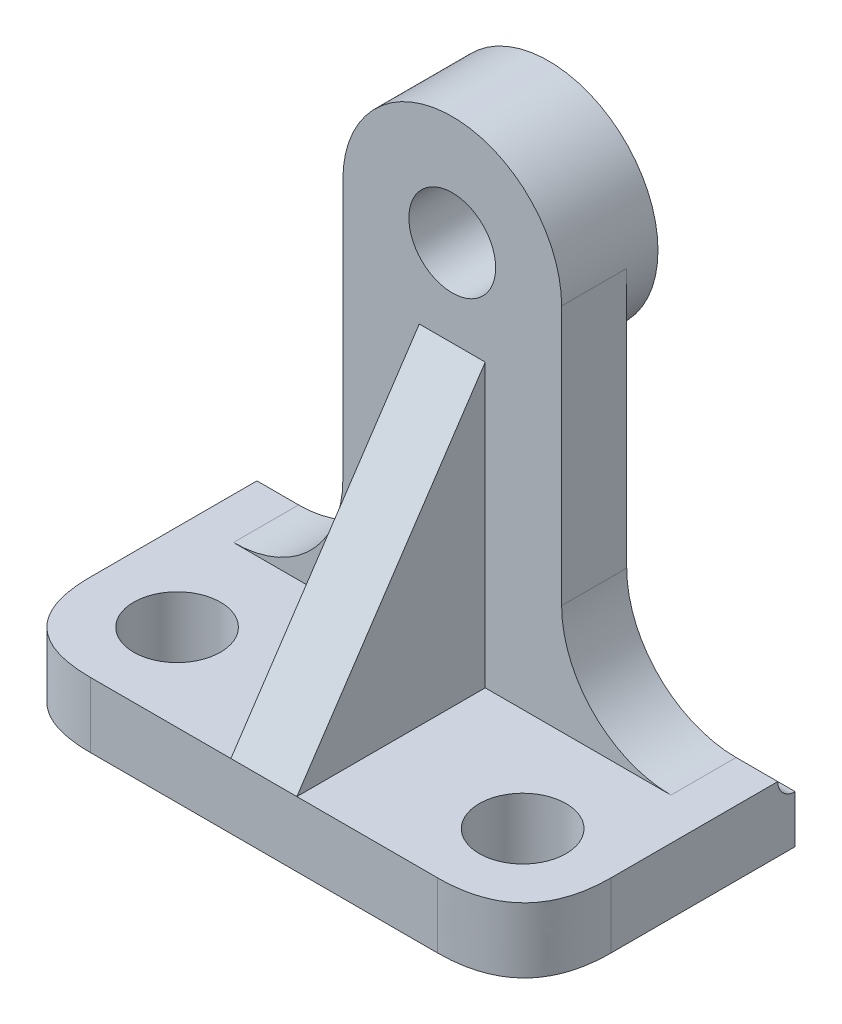
ISO-10303-21;
HEADER;
FILE_DESCRIPTION(('STEP AP214'),'2;1');
FILE_NAME('part.step','',(''),(''),'','','');
FILE_SCHEMA(('AUTOMOTIVE_DESIGN { 1 0 10303 214 1 1 1 1 }'));
ENDSEC;
DATA;
#1=APPLICATION_CONTEXT('core data for automotive mechanical design processes');
#2=APPLICATION_PROTOCOL_DEFINITION('international standard','automotive_design',2000,#1);
#3=PRODUCT_CONTEXT('',#1,'mechanical');
#4=PRODUCT('Part','Part','',(#3));
#5=PRODUCT_RELATED_PRODUCT_CATEGORY('part','',(#4));
#6=PRODUCT_DEFINITION_FORMATION('','',#4);
#7=PRODUCT_DEFINITION_CONTEXT('part definition',#1,'design');
#8=PRODUCT_DEFINITION('design','',#6,#7);
#9=PRODUCT_DEFINITION_SHAPE('','',#8);
#10=(LENGTH_UNIT() NAMED_UNIT(*) SI_UNIT(.MILLI.,.METRE.));
#11=(NAMED_UNIT(*) PLANE_ANGLE_UNIT() SI_UNIT($,.RADIAN.));
#12=(NAMED_UNIT(*) SI_UNIT($,.STERADIAN.) SOLID_ANGLE_UNIT());
#13=UNCERTAINTY_MEASURE_WITH_UNIT(LENGTH_MEASURE(1.E-05),#10,'distance_accuracy_value','');
#14=(GEOMETRIC_REPRESENTATION_CONTEXT(3) GLOBAL_UNCERTAINTY_ASSIGNED_CONTEXT((#13)) GLOBAL_UNIT_ASSIGNED_CONTEXT((#10,
#11,#12)) REPRESENTATION_CONTEXT('',''));
#15=CARTESIAN_POINT('',(0.,0.,0.));
#16=DIRECTION('',(0.,0.,1.));
#17=DIRECTION('',(1.,0.,0.));
#18=AXIS2_PLACEMENT_3D('',#15,#16,#17);
#19=CARTESIAN_POINT('',(0.,0.,0.));
#20=DIRECTION('',(0.,-1.,0.));
#21=DIRECTION('',(0.,0.,-1.));
#22=AXIS2_PLACEMENT_3D('',#19,#20,#21);
#23=PLANE('',#22);
#24=DIRECTION('',(0.,0.,-1.));
#25=VECTOR('',#24,1.);
#26=CARTESIAN_POINT('',(-4.826,0.,19.812));
#27=LINE('',#26,#25);
#28=CARTESIAN_POINT('',(-4.826,0.,19.812));
#29=VERTEX_POINT('',#28);
#30=CARTESIAN_POINT('',(-4.826,0.,-7.747));
#31=VERTEX_POINT('',#30);
#32=EDGE_CURVE('E627',#29,#31,#27,.T.);
#33=ORIENTED_EDGE('',*,*,#32,.T.);
#34=DIRECTION('',(1.,0.,0.));
#35=VECTOR('',#34,1.);
#36=CARTESIAN_POINT('',(-32.004,0.,-7.747));
#37=LINE('',#36,#35);
#38=CARTESIAN_POINT('',(-32.004,0.,-7.747));
#39=VERTEX_POINT('',#38);
#40=EDGE_CURVE('E195',#39,#31,#37,.T.);
#41=ORIENTED_EDGE('',*,*,#40,.F.);
#42=DIRECTION('',(0.,0.,-1.));
#43=VECTOR('',#42,1.);
#44=CARTESIAN_POINT('',(-32.004,0.,-7.747));
#45=LINE('',#44,#43);
#46=CARTESIAN_POINT('',(-32.004,0.,-17.272));
#47=VERTEX_POINT('',#46);
#48=EDGE_CURVE('E239',#39,#47,#45,.T.);
#49=ORIENTED_EDGE('',*,*,#48,.T.);
#50=DIRECTION('',(1.,0.,0.));
#51=VECTOR('',#50,1.);
#52=CARTESIAN_POINT('',(-38.1,0.,-17.272));
#53=LINE('',#52,#51);
#54=CARTESIAN_POINT('',(-38.1,0.,-17.272));
#55=VERTEX_POINT('',#54);
#56=EDGE_CURVE('E264',#55,#47,#53,.T.);
#57=ORIENTED_EDGE('',*,*,#56,.F.);
#58=DIRECTION('',(0.,0.,1.));
#59=VECTOR('',#58,1.);
#60=CARTESIAN_POINT('',(-38.1,0.,19.812));
#61=LINE('',#60,#59);
#62=CARTESIAN_POINT('',(-38.1,0.,7.112));
#63=VERTEX_POINT('',#62);
#64=EDGE_CURVE('E427',#55,#63,#61,.T.);
#65=ORIENTED_EDGE('',*,*,#64,.T.);
#66=CARTESIAN_POINT('',(-25.4,0.,19.812));
#67=CARTESIAN_POINT('',(-38.1,0.,19.812));
#68=CARTESIAN_POINT('',(-38.1,0.,7.112));
#69=(BOUNDED_CURVE() B_SPLINE_CURVE(2,(#66,#67,#68),.UNSPECIFIED.,.F.,
.F.) B_SPLINE_CURVE_WITH_KNOTS((3,3),(0.,1.),
.UNSPECIFIED.) CURVE() GEOMETRIC_REPRESENTATION_ITEM() RATIONAL_B_SPLINE_CURVE((1.,1.,1.)) REPRESENTATION_ITEM(''));
#70=CARTESIAN_POINT('',(-25.4,0.,19.812));
#71=VERTEX_POINT('',#70);
#72=EDGE_CURVE('E455',#63,#71,#69,.F.);
#73=ORIENTED_EDGE('',*,*,#72,.T.);
#74=DIRECTION('',(1.,0.,0.));
#75=VECTOR('',#74,1.);
#76=CARTESIAN_POINT('',(-38.1,0.,19.812));
#77=LINE('',#76,#75);
#78=EDGE_CURVE('E277',#71,#29,#77,.T.);
#79=ORIENTED_EDGE('',*,*,#78,.T.);
#80=EDGE_LOOP('',(#33,#41,#49,#57,#65,#73,#79));
#81=FACE_BOUND('',#80,.T.);
#82=CARTESIAN_POINT('',(-25.4,0.,7.112));
#83=DIRECTION('',(0.,1.,0.));
#84=DIRECTION('',(0.,0.,1.));
#85=AXIS2_PLACEMENT_3D('',#82,#83,#84);
#86=CIRCLE('',#85,6.34999999999999);
#87=CARTESIAN_POINT('',(-25.4,0.,13.462));
#88=VERTEX_POINT('',#87);
#89=EDGE_CURVE('E630',#88,#88,#86,.T.);
#90=ORIENTED_EDGE('',*,*,#89,.F.);
#91=EDGE_LOOP('',(#90));
#92=FACE_BOUND('',#91,.T.);
#93=ADVANCED_FACE('F49',(#81,#92),#23,.F.);
#94=CARTESIAN_POINT('',(25.3994401556103,0.,7.35049502420474));
#95=DIRECTION('',(0.,1.,0.));
#96=DIRECTION('',(0.,0.,1.));
#97=AXIS2_PLACEMENT_3D('',#94,#95,#96);
#98=CIRCLE('',#97,6.34999999999998);
#99=CARTESIAN_POINT('',(25.3994401556103,0.,13.7004950242047));
#100=VERTEX_POINT('',#99);
#101=EDGE_CURVE('E618',#100,#100,#98,.T.);
#102=ORIENTED_EDGE('',*,*,#101,.F.);
#103=EDGE_LOOP('',(#102));
#104=FACE_BOUND('',#103,.T.);
#105=CARTESIAN_POINT('',(4.826,0.,-7.747));
#106=VERTEX_POINT('',#105);
#107=CARTESIAN_POINT('',(32.004,0.,-7.747));
#108=VERTEX_POINT('',#107);
#109=EDGE_CURVE('E184',#106,#108,#37,.T.);
#110=ORIENTED_EDGE('',*,*,#109,.F.);
#111=DIRECTION('',(0.,0.,-1.));
#112=VECTOR('',#111,1.);
#113=CARTESIAN_POINT('',(4.826,0.,19.812));
#114=LINE('',#113,#112);
#115=CARTESIAN_POINT('',(4.826,0.,19.812));
#116=VERTEX_POINT('',#115);
#117=EDGE_CURVE('E168',#116,#106,#114,.T.);
#118=ORIENTED_EDGE('',*,*,#117,.F.);
#119=CARTESIAN_POINT('',(25.3999999999999,0.,19.812));
#120=VERTEX_POINT('',#119);
#121=EDGE_CURVE('E419',#116,#120,#77,.T.);
#122=ORIENTED_EDGE('',*,*,#121,.T.);
#123=CARTESIAN_POINT('',(38.1,0.,7.112));
#124=CARTESIAN_POINT('',(38.1,0.,19.812));
#125=CARTESIAN_POINT('',(25.4,0.,19.812));
#126=(BOUNDED_CURVE() B_SPLINE_CURVE(2,(#123,#124,#125),.UNSPECIFIED.,.F.,
.F.) B_SPLINE_CURVE_WITH_KNOTS((3,3),(0.,1.),
.UNSPECIFIED.) CURVE() GEOMETRIC_REPRESENTATION_ITEM() RATIONAL_B_SPLINE_CURVE((1.,1.,1.)) REPRESENTATION_ITEM(''));
#127=CARTESIAN_POINT('',(38.1,0.,7.11200000000001));
#128=VERTEX_POINT('',#127);
#129=EDGE_CURVE('E387',#120,#128,#126,.F.);
#130=ORIENTED_EDGE('',*,*,#129,.T.);
#131=DIRECTION('',(0.,0.,-1.));
#132=VECTOR('',#131,1.);
#133=CARTESIAN_POINT('',(38.1,0.,19.812));
#134=LINE('',#133,#132);
#135=CARTESIAN_POINT('',(38.1,0.,-17.272));
#136=VERTEX_POINT('',#135);
#137=EDGE_CURVE('E263',#128,#136,#134,.T.);
#138=ORIENTED_EDGE('',*,*,#137,.T.);
#139=CARTESIAN_POINT('',(32.004,0.,-17.272));
#140=VERTEX_POINT('',#139);
#141=EDGE_CURVE('E256',#140,#136,#53,.T.);
#142=ORIENTED_EDGE('',*,*,#141,.F.);
#143=DIRECTION('',(0.,0.,-1.));
#144=VECTOR('',#143,1.);
#145=CARTESIAN_POINT('',(32.004,0.,-7.747));
#146=LINE('',#145,#144);
#147=EDGE_CURVE('E193',#108,#140,#146,.T.);
#148=ORIENTED_EDGE('',*,*,#147,.F.);
#149=EDGE_LOOP('',(#110,#118,#122,#130,#138,#142,#148));
#150=FACE_BOUND('',#149,.T.);
#151=ADVANCED_FACE('F191',(#104,#150),#23,.F.);
#152=CARTESIAN_POINT('',(38.1,-9.525,19.812));
#153=DIRECTION('',(1.,0.,0.));
#154=DIRECTION('',(0.,0.,-1.));
#155=AXIS2_PLACEMENT_3D('',#152,#153,#154);
#156=PLANE('',#155);
#157=ORIENTED_EDGE('',*,*,#137,.F.);
#158=CARTESIAN_POINT('',(38.1,-10.00125,7.112));
#159=CARTESIAN_POINT('',(38.1,-6.50875000000001,7.112));
#160=CARTESIAN_POINT('',(38.1,-3.01624999999999,7.112));
#161=CARTESIAN_POINT('',(38.1,0.476249999999999,7.112));
#162=(BOUNDED_CURVE() B_SPLINE_CURVE(3,(#158,#159,#160,#161),.UNSPECIFIED.,.F.,
.F.) B_SPLINE_CURVE_WITH_KNOTS((4,4),(-0.00047625,0.01000125),
.UNSPECIFIED.) CURVE() GEOMETRIC_REPRESENTATION_ITEM() RATIONAL_B_SPLINE_CURVE((1.,1.,1.,1.)) REPRESENTATION_ITEM(''));
#163=CARTESIAN_POINT('',(38.1,-9.525,7.112));
#164=VERTEX_POINT('',#163);
#165=EDGE_CURVE('E12',#128,#164,#162,.F.);
#166=ORIENTED_EDGE('',*,*,#165,.T.);
#167=DIRECTION('',(0.,0.,-1.));
#168=VECTOR('',#167,1.);
#169=CARTESIAN_POINT('',(38.1,-9.525,19.812));
#170=LINE('',#169,#168);
#171=CARTESIAN_POINT('',(38.1,-9.525,-19.812));
#172=VERTEX_POINT('',#171);
#173=EDGE_CURVE('E273',#164,#172,#170,.T.);
#174=ORIENTED_EDGE('',*,*,#173,.T.);
#175=DIRECTION('',(0.,1.,0.));
#176=VECTOR('',#175,1.);
#177=CARTESIAN_POINT('',(38.1,-9.525,-19.812));
#178=LINE('',#177,#176);
#179=CARTESIAN_POINT('',(38.1,-2.54,-19.812));
#180=VERTEX_POINT('',#179);
#181=EDGE_CURVE('E469',#172,#180,#178,.T.);
#182=ORIENTED_EDGE('',*,*,#181,.T.);
#183=CARTESIAN_POINT('',(38.1,0.,-19.812));
#184=DIRECTION('',(1.,0.,0.));
#185=DIRECTION('',(0.,0.,-1.));
#186=AXIS2_PLACEMENT_3D('',#183,#184,#185);
#187=CIRCLE('',#186,2.54);
#188=EDGE_CURVE('E251',#136,#180,#187,.T.);
#189=ORIENTED_EDGE('',*,*,#188,.F.);
#190=EDGE_LOOP('',(#157,#166,#174,#182,#189));
#191=FACE_BOUND('',#190,.T.);
#192=ADVANCED_FACE('F327',(#191),#156,.T.);
#193=CARTESIAN_POINT('',(-38.1,-9.525,19.812));
#194=DIRECTION('',(0.,0.,1.));
#195=DIRECTION('',(1.,0.,0.));
#196=AXIS2_PLACEMENT_3D('',#193,#194,#195);
#197=PLANE('',#196);
#198=ORIENTED_EDGE('',*,*,#78,.F.);
#199=CARTESIAN_POINT('',(-25.4,-10.00125,19.812));
#200=CARTESIAN_POINT('',(-25.4,-6.50875000000001,19.812));
#201=CARTESIAN_POINT('',(-25.4,-3.01624999999999,19.812));
#202=CARTESIAN_POINT('',(-25.4,0.476249999999999,19.812));
#203=(BOUNDED_CURVE() B_SPLINE_CURVE(3,(#199,#200,#201,#202),.UNSPECIFIED.,.F.,
.F.) B_SPLINE_CURVE_WITH_KNOTS((4,4),(-0.00047625,0.01000125),
.UNSPECIFIED.) CURVE() GEOMETRIC_REPRESENTATION_ITEM() RATIONAL_B_SPLINE_CURVE((1.,1.,1.,1.)) REPRESENTATION_ITEM(''));
#204=CARTESIAN_POINT('',(-25.4,-9.525,19.812));
#205=VERTEX_POINT('',#204);
#206=EDGE_CURVE('E374',#71,#205,#203,.F.);
#207=ORIENTED_EDGE('',*,*,#206,.T.);
#208=DIRECTION('',(1.,0.,0.));
#209=VECTOR('',#208,1.);
#210=CARTESIAN_POINT('',(-38.1,-9.525,19.812));
#211=LINE('',#210,#209);
#212=CARTESIAN_POINT('',(25.3999999999999,-9.525,19.812));
#213=VERTEX_POINT('',#212);
#214=EDGE_CURVE('E460',#205,#213,#211,.T.);
#215=ORIENTED_EDGE('',*,*,#214,.T.);
#216=CARTESIAN_POINT('',(25.4,0.476249999999999,19.812));
#217=CARTESIAN_POINT('',(25.4,-3.01624999999999,19.812));
#218=CARTESIAN_POINT('',(25.4,-6.50875000000001,19.812));
#219=CARTESIAN_POINT('',(25.4,-10.00125,19.812));
#220=(BOUNDED_CURVE() B_SPLINE_CURVE(3,(#216,#217,#218,#219),.UNSPECIFIED.,.F.,
.F.) B_SPLINE_CURVE_WITH_KNOTS((4,4),(-0.000476249999999999,0.01000125),
.UNSPECIFIED.) CURVE() GEOMETRIC_REPRESENTATION_ITEM() RATIONAL_B_SPLINE_CURVE((1.,1.,1.,1.)) REPRESENTATION_ITEM(''));
#221=EDGE_CURVE('E398',#213,#120,#220,.F.);
#222=ORIENTED_EDGE('',*,*,#221,.T.);
#223=ORIENTED_EDGE('',*,*,#121,.F.);
#224=DIRECTION('',(-1.,0.,0.));
#225=VECTOR('',#224,1.);
#226=CARTESIAN_POINT('',(4.826,0.,19.812));
#227=LINE('',#226,#225);
#228=EDGE_CURVE('E635',#116,#29,#227,.T.);
#229=ORIENTED_EDGE('',*,*,#228,.T.);
#230=EDGE_LOOP('',(#198,#207,#215,#222,#223,#229));
#231=FACE_BOUND('',#230,.T.);
#232=ADVANCED_FACE('F336',(#231),#197,.T.);
#233=CARTESIAN_POINT('',(-38.1,-9.525,19.812));
#234=DIRECTION('',(-1.,0.,0.));
#235=DIRECTION('',(0.,0.,1.));
#236=AXIS2_PLACEMENT_3D('',#233,#234,#235);
#237=PLANE('',#236);
#238=DIRECTION('',(0.,0.,1.));
#239=VECTOR('',#238,1.);
#240=CARTESIAN_POINT('',(-38.1,-9.525,19.812));
#241=LINE('',#240,#239);
#242=CARTESIAN_POINT('',(-38.1,-9.525,-19.812));
#243=VERTEX_POINT('',#242);
#244=CARTESIAN_POINT('',(-38.1,-9.525,7.112));
#245=VERTEX_POINT('',#244);
#246=EDGE_CURVE('E470',#243,#245,#241,.T.);
#247=ORIENTED_EDGE('',*,*,#246,.T.);
#248=CARTESIAN_POINT('',(-38.1,0.476249999999999,7.112));
#249=CARTESIAN_POINT('',(-38.1,-3.01624999999999,7.112));
#250=CARTESIAN_POINT('',(-38.1,-6.50875000000001,7.112));
#251=CARTESIAN_POINT('',(-38.1,-10.00125,7.112));
#252=(BOUNDED_CURVE() B_SPLINE_CURVE(3,(#248,#249,#250,#251),.UNSPECIFIED.,.F.,
.F.) B_SPLINE_CURVE_WITH_KNOTS((4,4),(-0.000476249999999999,0.01000125),
.UNSPECIFIED.) CURVE() GEOMETRIC_REPRESENTATION_ITEM() RATIONAL_B_SPLINE_CURVE((1.,1.,1.,1.)) REPRESENTATION_ITEM(''));
#253=EDGE_CURVE('E485',#245,#63,#252,.F.);
#254=ORIENTED_EDGE('',*,*,#253,.T.);
#255=ORIENTED_EDGE('',*,*,#64,.F.);
#256=CARTESIAN_POINT('',(-38.1,0.,-19.812));
#257=DIRECTION('',(1.,0.,0.));
#258=DIRECTION('',(0.,0.,-1.));
#259=AXIS2_PLACEMENT_3D('',#256,#257,#258);
#260=CIRCLE('',#259,2.54);
#261=CARTESIAN_POINT('',(-38.1,-2.54,-19.812));
#262=VERTEX_POINT('',#261);
#263=EDGE_CURVE('E252',#55,#262,#260,.T.);
#264=ORIENTED_EDGE('',*,*,#263,.T.);
#265=DIRECTION('',(0.,1.,0.));
#266=VECTOR('',#265,1.);
#267=CARTESIAN_POINT('',(-38.1,-9.525,-19.812));
#268=LINE('',#267,#266);
#269=EDGE_CURVE('E433',#243,#262,#268,.T.);
#270=ORIENTED_EDGE('',*,*,#269,.F.);
#271=EDGE_LOOP('',(#247,#254,#255,#264,#270));
#272=FACE_BOUND('',#271,.T.);
#273=ADVANCED_FACE('F488',(#272),#237,.T.);
#274=CARTESIAN_POINT('',(-38.1,-9.525,-19.812));
#275=DIRECTION('',(0.,0.,-1.));
#276=DIRECTION('',(-1.,0.,0.));
#277=AXIS2_PLACEMENT_3D('',#274,#275,#276);
#278=PLANE('',#277);
#279=DIRECTION('',(1.,0.,0.));
#280=VECTOR('',#279,1.);
#281=CARTESIAN_POINT('',(-38.1,-2.54,-19.812));
#282=LINE('',#281,#280);
#283=EDGE_CURVE('E259',#262,#180,#282,.T.);
#284=ORIENTED_EDGE('',*,*,#283,.T.);
#285=ORIENTED_EDGE('',*,*,#181,.F.);
#286=DIRECTION('',(-1.,0.,0.));
#287=VECTOR('',#286,1.);
#288=CARTESIAN_POINT('',(-38.1,-9.525,-19.812));
#289=LINE('',#288,#287);
#290=EDGE_CURVE('E270',#172,#243,#289,.T.);
#291=ORIENTED_EDGE('',*,*,#290,.T.);
#292=ORIENTED_EDGE('',*,*,#269,.T.);
#293=EDGE_LOOP('',(#284,#285,#291,#292));
#294=FACE_BOUND('',#293,.T.);
#295=ADVANCED_FACE('F305',(#294),#278,.T.);
#296=CARTESIAN_POINT('',(0.,-9.525,0.));
#297=DIRECTION('',(0.,-1.,0.));
#298=DIRECTION('',(0.,0.,-1.));
#299=AXIS2_PLACEMENT_3D('',#296,#297,#298);
#300=PLANE('',#299);
#301=CARTESIAN_POINT('',(-25.4,-9.525,7.112));
#302=DIRECTION('',(0.,-1.,0.));
#303=DIRECTION('',(0.,0.,-1.));
#304=AXIS2_PLACEMENT_3D('',#301,#302,#303);
#305=CIRCLE('',#304,6.34999999999999);
#306=CARTESIAN_POINT('',(-25.4,-9.525,0.762000000000011));
#307=VERTEX_POINT('',#306);
#308=EDGE_CURVE('E57',#307,#307,#305,.T.);
#309=ORIENTED_EDGE('',*,*,#308,.F.);
#310=EDGE_LOOP('',(#309));
#311=FACE_BOUND('',#310,.T.);
#312=CARTESIAN_POINT('',(25.3994401556103,-9.525,7.35049502420474));
#313=DIRECTION('',(0.,-1.,0.));
#314=DIRECTION('',(0.,0.,-1.));
#315=AXIS2_PLACEMENT_3D('',#312,#313,#314);
#316=CIRCLE('',#315,6.34999999999999);
#317=CARTESIAN_POINT('',(25.3994401556103,-9.525,1.00049502420475));
#318=VERTEX_POINT('',#317);
#319=EDGE_CURVE('E621',#318,#318,#316,.T.);
#320=ORIENTED_EDGE('',*,*,#319,.F.);
#321=EDGE_LOOP('',(#320));
#322=FACE_BOUND('',#321,.T.);
#323=ORIENTED_EDGE('',*,*,#214,.F.);
#324=CARTESIAN_POINT('',(-38.1,-9.525,7.112));
#325=CARTESIAN_POINT('',(-38.1,-9.525,19.812));
#326=CARTESIAN_POINT('',(-25.4,-9.525,19.812));
#327=(BOUNDED_CURVE() B_SPLINE_CURVE(2,(#324,#325,#326),.UNSPECIFIED.,.F.,
.F.) B_SPLINE_CURVE_WITH_KNOTS((3,3),(0.,1.),
.UNSPECIFIED.) CURVE() GEOMETRIC_REPRESENTATION_ITEM() RATIONAL_B_SPLINE_CURVE((1.,1.,1.)) REPRESENTATION_ITEM(''));
#328=EDGE_CURVE('E63',#205,#245,#327,.F.);
#329=ORIENTED_EDGE('',*,*,#328,.T.);
#330=ORIENTED_EDGE('',*,*,#246,.F.);
#331=ORIENTED_EDGE('',*,*,#290,.F.);
#332=ORIENTED_EDGE('',*,*,#173,.F.);
#333=CARTESIAN_POINT('',(25.4,-9.525,19.812));
#334=CARTESIAN_POINT('',(38.1,-9.525,19.812));
#335=CARTESIAN_POINT('',(38.1,-9.525,7.11200000000001));
#336=(BOUNDED_CURVE() B_SPLINE_CURVE(2,(#333,#334,#335),.UNSPECIFIED.,.F.,
.F.) B_SPLINE_CURVE_WITH_KNOTS((3,3),(0.,1.),
.UNSPECIFIED.) CURVE() GEOMETRIC_REPRESENTATION_ITEM() RATIONAL_B_SPLINE_CURVE((1.,1.,1.)) REPRESENTATION_ITEM(''));
#337=EDGE_CURVE('E287',#164,#213,#336,.F.);
#338=ORIENTED_EDGE('',*,*,#337,.T.);
#339=EDGE_LOOP('',(#323,#329,#330,#331,#332,#338));
#340=FACE_BOUND('',#339,.T.);
#341=ADVANCED_FACE('F294',(#311,#322,#340),#300,.T.);
#342=CARTESIAN_POINT('',(-38.1,0.,-19.812));
#343=DIRECTION('',(1.,0.,0.));
#344=DIRECTION('',(0.,0.,-1.));
#345=AXIS2_PLACEMENT_3D('',#342,#343,#344);
#346=CYLINDRICAL_SURFACE('',#345,2.54);
#347=ORIENTED_EDGE('',*,*,#188,.T.);
#348=ORIENTED_EDGE('',*,*,#283,.F.);
#349=ORIENTED_EDGE('',*,*,#263,.F.);
#350=ORIENTED_EDGE('',*,*,#56,.T.);
#351=DIRECTION('',(1.,0.,0.));
#352=VECTOR('',#351,1.);
#353=CARTESIAN_POINT('',(-32.004,0.,-17.272));
#354=LINE('',#353,#352);
#355=EDGE_CURVE('E78',#47,#140,#354,.T.);
#356=ORIENTED_EDGE('',*,*,#355,.T.);
#357=ORIENTED_EDGE('',*,*,#141,.T.);
#358=EDGE_LOOP('',(#347,#348,#349,#350,#356,#357));
#359=FACE_BOUND('',#358,.T.);
#360=ADVANCED_FACE('F304',(#359),#346,.F.);
#361=CARTESIAN_POINT('',(-38.1,-10.00125,7.112));
#362=CARTESIAN_POINT('',(-38.1,-6.50875000000001,7.112));
#363=CARTESIAN_POINT('',(-38.1,-3.01624999999999,7.112));
#364=CARTESIAN_POINT('',(-38.1,0.476249999999999,7.112));
#365=CARTESIAN_POINT('',(-38.1,-10.00125,19.812));
#366=CARTESIAN_POINT('',(-38.1,-6.50875000000001,19.812));
#367=CARTESIAN_POINT('',(-38.1,-3.01624999999999,19.812));
#368=CARTESIAN_POINT('',(-38.1,0.476249999999999,19.812));
#369=CARTESIAN_POINT('',(-25.4,-10.00125,19.812));
#370=CARTESIAN_POINT('',(-25.4,-6.50875000000001,19.812));
#371=CARTESIAN_POINT('',(-25.4,-3.01624999999999,19.812));
#372=CARTESIAN_POINT('',(-25.4,0.476249999999999,19.812));
#373=(BOUNDED_SURFACE() B_SPLINE_SURFACE(2,3,((#361,#362,#363,#364),(#365,#366,#367,#368),(#369,
#370,#371,#372)),.UNSPECIFIED.,.F.,.F.,.F.) B_SPLINE_SURFACE_WITH_KNOTS((3,3),(4,4),(0.,1.),
(-0.00047625,0.01000125),
.UNSPECIFIED.) GEOMETRIC_REPRESENTATION_ITEM() RATIONAL_B_SPLINE_SURFACE(((1.,1.,1.,1.),(1.,1.,
1.,1.),(1.,1.,1.,1.))) REPRESENTATION_ITEM('') SURFACE());
#374=ORIENTED_EDGE('',*,*,#328,.F.);
#375=ORIENTED_EDGE('',*,*,#206,.F.);
#376=ORIENTED_EDGE('',*,*,#72,.F.);
#377=ORIENTED_EDGE('',*,*,#253,.F.);
#378=EDGE_LOOP('',(#374,#375,#376,#377));
#379=FACE_BOUND('',#378,.T.);
#380=ADVANCED_FACE('F339',(#379),#373,.T.);
#381=CARTESIAN_POINT('',(25.4,-10.00125,19.812));
#382=CARTESIAN_POINT('',(25.4,-6.50875000000001,19.812));
#383=CARTESIAN_POINT('',(25.4,-3.01624999999999,19.812));
#384=CARTESIAN_POINT('',(25.4,0.476249999999999,19.812));
#385=CARTESIAN_POINT('',(38.1,-10.00125,19.812));
#386=CARTESIAN_POINT('',(38.1,-6.50875000000001,19.812));
#387=CARTESIAN_POINT('',(38.1,-3.01624999999999,19.812));
#388=CARTESIAN_POINT('',(38.1,0.476249999999999,19.812));
#389=CARTESIAN_POINT('',(38.1,-10.00125,7.112));
#390=CARTESIAN_POINT('',(38.1,-6.50875000000001,7.112));
#391=CARTESIAN_POINT('',(38.1,-3.01624999999999,7.112));
#392=CARTESIAN_POINT('',(38.1,0.476249999999999,7.112));
#393=(BOUNDED_SURFACE() B_SPLINE_SURFACE(2,3,((#381,#382,#383,#384),(#385,#386,#387,#388),(#389,
#390,#391,#392)),.UNSPECIFIED.,.F.,.F.,.F.) B_SPLINE_SURFACE_WITH_KNOTS((3,3),(4,4),(0.,1.),
(-0.00047625,0.01000125),
.UNSPECIFIED.) GEOMETRIC_REPRESENTATION_ITEM() RATIONAL_B_SPLINE_SURFACE(((1.,1.,1.,1.),(1.,1.,
1.,1.),(1.,1.,1.,1.))) REPRESENTATION_ITEM('') SURFACE());
#394=ORIENTED_EDGE('',*,*,#337,.F.);
#395=ORIENTED_EDGE('',*,*,#165,.F.);
#396=ORIENTED_EDGE('',*,*,#129,.F.);
#397=ORIENTED_EDGE('',*,*,#221,.F.);
#398=EDGE_LOOP('',(#394,#395,#396,#397));
#399=FACE_BOUND('',#398,.T.);
#400=ADVANCED_FACE('F52',(#399),#393,.T.);
#401=CARTESIAN_POINT('',(0.,53.975,-7.747));
#402=DIRECTION('',(0.,0.,1.));
#403=DIRECTION('',(1.,0.,0.));
#404=AXIS2_PLACEMENT_3D('',#401,#402,#403);
#405=PLANE('',#404);
#406=DIRECTION('',(0.,1.,0.));
#407=VECTOR('',#406,1.);
#408=CARTESIAN_POINT('',(4.826,0.,-7.747));
#409=LINE('',#408,#407);
#410=CARTESIAN_POINT('',(4.826,41.275,-7.747));
#411=VERTEX_POINT('',#410);
#412=EDGE_CURVE('E171',#106,#411,#409,.T.);
#413=ORIENTED_EDGE('',*,*,#412,.F.);
#414=ORIENTED_EDGE('',*,*,#109,.T.);
#415=CARTESIAN_POINT('',(32.004,16.002,-7.747));
#416=DIRECTION('',(0.,0.,-1.));
#417=DIRECTION('',(1.,0.,0.));
#418=AXIS2_PLACEMENT_3D('',#415,#416,#417);
#419=CIRCLE('',#418,16.002);
#420=CARTESIAN_POINT('',(16.002,16.002,-7.747));
#421=VERTEX_POINT('',#420);
#422=EDGE_CURVE('E202',#108,#421,#419,.T.);
#423=ORIENTED_EDGE('',*,*,#422,.T.);
#424=DIRECTION('',(0.,1.,0.));
#425=VECTOR('',#424,1.);
#426=CARTESIAN_POINT('',(16.002,53.975,-7.747));
#427=LINE('',#426,#425);
#428=CARTESIAN_POINT('',(16.002,53.975,-7.747));
#429=VERTEX_POINT('',#428);
#430=EDGE_CURVE('E209',#421,#429,#427,.T.);
#431=ORIENTED_EDGE('',*,*,#430,.T.);
#432=CARTESIAN_POINT('',(0.,53.975,-7.747));
#433=DIRECTION('',(0.,0.,1.));
#434=DIRECTION('',(1.,0.,0.));
#435=AXIS2_PLACEMENT_3D('',#432,#433,#434);
#436=CIRCLE('',#435,16.002);
#437=CARTESIAN_POINT('',(-16.002,53.975,-7.747));
#438=VERTEX_POINT('',#437);
#439=EDGE_CURVE('E229',#429,#438,#436,.T.);
#440=ORIENTED_EDGE('',*,*,#439,.T.);
#441=DIRECTION('',(0.,-1.,0.));
#442=VECTOR('',#441,1.);
#443=CARTESIAN_POINT('',(-16.002,53.975,-7.747));
#444=LINE('',#443,#442);
#445=CARTESIAN_POINT('',(-16.002,16.002,-7.747));
#446=VERTEX_POINT('',#445);
#447=EDGE_CURVE('E203',#438,#446,#444,.T.);
#448=ORIENTED_EDGE('',*,*,#447,.T.);
#449=CARTESIAN_POINT('',(-32.004,16.002,-7.747));
#450=DIRECTION('',(0.,0.,-1.));
#451=DIRECTION('',(1.,0.,0.));
#452=AXIS2_PLACEMENT_3D('',#449,#450,#451);
#453=CIRCLE('',#452,16.002);
#454=EDGE_CURVE('E196',#446,#39,#453,.T.);
#455=ORIENTED_EDGE('',*,*,#454,.T.);
#456=ORIENTED_EDGE('',*,*,#40,.T.);
#457=DIRECTION('',(0.,1.,0.));
#458=VECTOR('',#457,1.);
#459=CARTESIAN_POINT('',(-4.826,0.,-7.747));
#460=LINE('',#459,#458);
#461=CARTESIAN_POINT('',(-4.826,41.275,-7.747));
#462=VERTEX_POINT('',#461);
#463=EDGE_CURVE('E638',#31,#462,#460,.T.);
#464=ORIENTED_EDGE('',*,*,#463,.T.);
#465=DIRECTION('',(-1.,0.,0.));
#466=VECTOR('',#465,1.);
#467=CARTESIAN_POINT('',(4.826,41.275,-7.747));
#468=LINE('',#467,#466);
#469=EDGE_CURVE('E187',#411,#462,#468,.T.);
#470=ORIENTED_EDGE('',*,*,#469,.F.);
#471=EDGE_LOOP('',(#413,#414,#423,#431,#440,#448,#455,#456,#464,#470));
#472=FACE_BOUND('',#471,.T.);
#473=CARTESIAN_POINT('',(0.,53.975,-7.747));
#474=DIRECTION('',(0.,0.,1.));
#475=DIRECTION('',(1.,0.,0.));
#476=AXIS2_PLACEMENT_3D('',#473,#474,#475);
#477=CIRCLE('',#476,6.35);
#478=CARTESIAN_POINT('',(6.35,53.975,-7.747));
#479=VERTEX_POINT('',#478);
#480=EDGE_CURVE('E647',#479,#479,#477,.T.);
#481=ORIENTED_EDGE('',*,*,#480,.F.);
#482=EDGE_LOOP('',(#481));
#483=FACE_BOUND('',#482,.T.);
#484=ADVANCED_FACE('F182',(#472,#483),#405,.T.);
#485=CARTESIAN_POINT('',(0.,53.975,-17.272));
#486=DIRECTION('',(0.,0.,1.));
#487=DIRECTION('',(1.,0.,0.));
#488=AXIS2_PLACEMENT_3D('',#485,#486,#487);
#489=PLANE('',#488);
#490=DIRECTION('',(0.,-1.,0.));
#491=VECTOR('',#490,1.);
#492=CARTESIAN_POINT('',(-16.002,53.975,-17.272));
#493=LINE('',#492,#491);
#494=CARTESIAN_POINT('',(-16.002,53.975,-17.272));
#495=VERTEX_POINT('',#494);
#496=CARTESIAN_POINT('',(-16.002,16.002,-17.272));
#497=VERTEX_POINT('',#496);
#498=EDGE_CURVE('E213',#495,#497,#493,.T.);
#499=ORIENTED_EDGE('',*,*,#498,.F.);
#500=CARTESIAN_POINT('',(0.,53.975,-17.272));
#501=DIRECTION('',(0.,0.,1.));
#502=DIRECTION('',(1.,0.,0.));
#503=AXIS2_PLACEMENT_3D('',#500,#501,#502);
#504=CIRCLE('',#503,16.002);
#505=CARTESIAN_POINT('',(16.002,53.975,-17.272));
#506=VERTEX_POINT('',#505);
#507=EDGE_CURVE('E217',#495,#506,#504,.T.);
#508=ORIENTED_EDGE('',*,*,#507,.T.);
#509=DIRECTION('',(0.,1.,0.));
#510=VECTOR('',#509,1.);
#511=CARTESIAN_POINT('',(16.002,53.975,-17.272));
#512=LINE('',#511,#510);
#513=CARTESIAN_POINT('',(16.002,16.002,-17.272));
#514=VERTEX_POINT('',#513);
#515=EDGE_CURVE('E225',#514,#506,#512,.T.);
#516=ORIENTED_EDGE('',*,*,#515,.F.);
#517=CARTESIAN_POINT('',(32.004,16.002,-17.272));
#518=DIRECTION('',(0.,0.,-1.));
#519=DIRECTION('',(1.,0.,0.));
#520=AXIS2_PLACEMENT_3D('',#517,#518,#519);
#521=CIRCLE('',#520,16.002);
#522=EDGE_CURVE('E222',#140,#514,#521,.T.);
#523=ORIENTED_EDGE('',*,*,#522,.F.);
#524=ORIENTED_EDGE('',*,*,#355,.F.);
#525=CARTESIAN_POINT('',(-32.004,16.002,-17.272));
#526=DIRECTION('',(0.,0.,-1.));
#527=DIRECTION('',(1.,0.,0.));
#528=AXIS2_PLACEMENT_3D('',#525,#526,#527);
#529=CIRCLE('',#528,16.002);
#530=EDGE_CURVE('E216',#497,#47,#529,.T.);
#531=ORIENTED_EDGE('',*,*,#530,.F.);
#532=EDGE_LOOP('',(#499,#508,#516,#523,#524,#531));
#533=FACE_BOUND('',#532,.T.);
#534=ADVANCED_FACE('F570',(#533),#489,.F.);
#535=CARTESIAN_POINT('',(0.,53.975,-7.747));
#536=DIRECTION('',(0.,0.,-1.));
#537=DIRECTION('',(-1.,0.,0.));
#538=AXIS2_PLACEMENT_3D('',#535,#536,#537);
#539=CYLINDRICAL_SURFACE('',#538,16.002);
#540=DIRECTION('',(0.,0.,-1.));
#541=VECTOR('',#540,1.);
#542=CARTESIAN_POINT('',(16.002,53.975,-7.747));
#543=LINE('',#542,#541);
#544=EDGE_CURVE('E212',#429,#506,#543,.T.);
#545=ORIENTED_EDGE('',*,*,#544,.T.);
#546=ORIENTED_EDGE('',*,*,#507,.F.);
#547=DIRECTION('',(0.,0.,-1.));
#548=VECTOR('',#547,1.);
#549=CARTESIAN_POINT('',(-16.002,53.975,-7.747));
#550=LINE('',#549,#548);
#551=EDGE_CURVE('E247',#438,#495,#550,.T.);
#552=ORIENTED_EDGE('',*,*,#551,.F.);
#553=ORIENTED_EDGE('',*,*,#439,.F.);
#554=EDGE_LOOP('',(#545,#546,#552,#553));
#555=FACE_BOUND('',#554,.T.);
#556=CARTESIAN_POINT('',(0.,53.975,-21.844));
#557=DIRECTION('',(0.,0.,1.));
#558=DIRECTION('',(1.,0.,0.));
#559=AXIS2_PLACEMENT_3D('',#556,#557,#558);
#560=CIRCLE('',#559,16.002);
#561=CARTESIAN_POINT('',(16.002,53.975,-21.844));
#562=VERTEX_POINT('',#561);
#563=EDGE_CURVE('E582',#562,#562,#560,.T.);
#564=ORIENTED_EDGE('',*,*,#563,.T.);
#565=EDGE_LOOP('',(#564));
#566=FACE_BOUND('',#565,.T.);
#567=ADVANCED_FACE('F578',(#555,#566),#539,.T.);
#568=CARTESIAN_POINT('',(-16.002,53.975,-7.747));
#569=DIRECTION('',(1.,0.,0.));
#570=DIRECTION('',(0.,0.,-1.));
#571=AXIS2_PLACEMENT_3D('',#568,#569,#570);
#572=PLANE('',#571);
#573=ORIENTED_EDGE('',*,*,#498,.T.);
#574=DIRECTION('',(0.,0.,-1.));
#575=VECTOR('',#574,1.);
#576=CARTESIAN_POINT('',(-16.002,16.002,-7.747));
#577=LINE('',#576,#575);
#578=EDGE_CURVE('E243',#446,#497,#577,.T.);
#579=ORIENTED_EDGE('',*,*,#578,.F.);
#580=ORIENTED_EDGE('',*,*,#447,.F.);
#581=ORIENTED_EDGE('',*,*,#551,.T.);
#582=EDGE_LOOP('',(#573,#579,#580,#581));
#583=FACE_BOUND('',#582,.T.);
#584=ADVANCED_FACE('F574',(#583),#572,.F.);
#585=CARTESIAN_POINT('',(-32.004,16.002,-7.747));
#586=DIRECTION('',(0.,0.,-1.));
#587=DIRECTION('',(-1.,0.,0.));
#588=AXIS2_PLACEMENT_3D('',#585,#586,#587);
#589=CYLINDRICAL_SURFACE('',#588,16.002);
#590=ORIENTED_EDGE('',*,*,#530,.T.);
#591=ORIENTED_EDGE('',*,*,#48,.F.);
#592=ORIENTED_EDGE('',*,*,#454,.F.);
#593=ORIENTED_EDGE('',*,*,#578,.T.);
#594=EDGE_LOOP('',(#590,#591,#592,#593));
#595=FACE_BOUND('',#594,.T.);
#596=ADVANCED_FACE('F567',(#595),#589,.F.);
#597=CARTESIAN_POINT('',(32.004,16.002,-7.747));
#598=DIRECTION('',(0.,0.,-1.));
#599=DIRECTION('',(-1.,0.,0.));
#600=AXIS2_PLACEMENT_3D('',#597,#598,#599);
#601=CYLINDRICAL_SURFACE('',#600,16.002);
#602=ORIENTED_EDGE('',*,*,#522,.T.);
#603=DIRECTION('',(0.,0.,-1.));
#604=VECTOR('',#603,1.);
#605=CARTESIAN_POINT('',(16.002,16.002,-7.747));
#606=LINE('',#605,#604);
#607=EDGE_CURVE('E233',#421,#514,#606,.T.);
#608=ORIENTED_EDGE('',*,*,#607,.F.);
#609=ORIENTED_EDGE('',*,*,#422,.F.);
#610=ORIENTED_EDGE('',*,*,#147,.T.);
#611=EDGE_LOOP('',(#602,#608,#609,#610));
#612=FACE_BOUND('',#611,.T.);
#613=ADVANCED_FACE('F599',(#612),#601,.F.);
#614=CARTESIAN_POINT('',(16.002,53.975,-7.747));
#615=DIRECTION('',(-1.,0.,0.));
#616=DIRECTION('',(0.,-1.,0.));
#617=AXIS2_PLACEMENT_3D('',#614,#615,#616);
#618=PLANE('',#617);
#619=ORIENTED_EDGE('',*,*,#515,.T.);
#620=ORIENTED_EDGE('',*,*,#544,.F.);
#621=ORIENTED_EDGE('',*,*,#430,.F.);
#622=ORIENTED_EDGE('',*,*,#607,.T.);
#623=EDGE_LOOP('',(#619,#620,#621,#622));
#624=FACE_BOUND('',#623,.T.);
#625=ADVANCED_FACE('F597',(#624),#618,.F.);
#626=CARTESIAN_POINT('',(0.,53.975,-21.844));
#627=DIRECTION('',(0.,0.,1.));
#628=DIRECTION('',(1.,0.,0.));
#629=AXIS2_PLACEMENT_3D('',#626,#627,#628);
#630=PLANE('',#629);
#631=CARTESIAN_POINT('',(0.,53.975,-21.844));
#632=DIRECTION('',(0.,0.,1.));
#633=DIRECTION('',(1.,0.,0.));
#634=AXIS2_PLACEMENT_3D('',#631,#632,#633);
#635=CIRCLE('',#634,6.35);
#636=CARTESIAN_POINT('',(6.35,53.975,-21.844));
#637=VERTEX_POINT('',#636);
#638=EDGE_CURVE('E587',#637,#637,#635,.T.);
#639=ORIENTED_EDGE('',*,*,#638,.T.);
#640=EDGE_LOOP('',(#639));
#641=FACE_BOUND('',#640,.T.);
#642=ORIENTED_EDGE('',*,*,#563,.F.);
#643=EDGE_LOOP('',(#642));
#644=FACE_BOUND('',#643,.T.);
#645=ADVANCED_FACE('F606',(#641,#644),#630,.F.);
#646=CARTESIAN_POINT('',(0.,53.975,-21.844));
#647=DIRECTION('',(0.,0.,1.));
#648=DIRECTION('',(1.,0.,0.));
#649=AXIS2_PLACEMENT_3D('',#646,#647,#648);
#650=CYLINDRICAL_SURFACE('',#649,6.35);
#651=ORIENTED_EDGE('',*,*,#638,.F.);
#652=EDGE_LOOP('',(#651));
#653=FACE_BOUND('',#652,.T.);
#654=ORIENTED_EDGE('',*,*,#480,.T.);
#655=EDGE_LOOP('',(#654));
#656=FACE_BOUND('',#655,.T.);
#657=ADVANCED_FACE('F655',(#653,#656),#650,.F.);
#658=CARTESIAN_POINT('',(4.826,41.275,-7.747));
#659=DIRECTION('',(0.,-0.555290581777434,-0.831656401279566));
#660=DIRECTION('',(0.,0.831656401279566,-0.555290581777434));
#661=AXIS2_PLACEMENT_3D('',#658,#659,#660);
#662=PLANE('',#661);
#663=DIRECTION('',(0.,-0.831656401279566,0.555290581777434));
#664=VECTOR('',#663,1.);
#665=CARTESIAN_POINT('',(-4.826,41.275,-7.747));
#666=LINE('',#665,#664);
#667=EDGE_CURVE('E70',#462,#29,#666,.T.);
#668=ORIENTED_EDGE('',*,*,#667,.T.);
#669=ORIENTED_EDGE('',*,*,#228,.F.);
#670=DIRECTION('',(0.,-0.831656401279566,0.555290581777434));
#671=VECTOR('',#670,1.);
#672=CARTESIAN_POINT('',(4.826,41.275,-7.747));
#673=LINE('',#672,#671);
#674=EDGE_CURVE('E173',#411,#116,#673,.T.);
#675=ORIENTED_EDGE('',*,*,#674,.F.);
#676=ORIENTED_EDGE('',*,*,#469,.T.);
#677=EDGE_LOOP('',(#668,#669,#675,#676));
#678=FACE_BOUND('',#677,.T.);
#679=ADVANCED_FACE('F669',(#678),#662,.F.);
#680=CARTESIAN_POINT('',(4.826,0.,0.));
#681=DIRECTION('',(1.,0.,0.));
#682=DIRECTION('',(0.,0.,-1.));
#683=AXIS2_PLACEMENT_3D('',#680,#681,#682);
#684=PLANE('',#683);
#685=ORIENTED_EDGE('',*,*,#117,.T.);
#686=ORIENTED_EDGE('',*,*,#412,.T.);
#687=ORIENTED_EDGE('',*,*,#674,.T.);
#688=EDGE_LOOP('',(#685,#686,#687));
#689=FACE_BOUND('',#688,.T.);
#690=ADVANCED_FACE('F170',(#689),#684,.T.);
#691=CARTESIAN_POINT('',(-4.826,0.,0.));
#692=DIRECTION('',(1.,0.,0.));
#693=DIRECTION('',(0.,0.,-1.));
#694=AXIS2_PLACEMENT_3D('',#691,#692,#693);
#695=PLANE('',#694);
#696=ORIENTED_EDGE('',*,*,#32,.F.);
#697=ORIENTED_EDGE('',*,*,#667,.F.);
#698=ORIENTED_EDGE('',*,*,#463,.F.);
#699=EDGE_LOOP('',(#696,#697,#698));
#700=FACE_BOUND('',#699,.T.);
#701=ADVANCED_FACE('F674',(#700),#695,.F.);
#702=CARTESIAN_POINT('',(25.3994401556103,0.,7.35049502420474));
#703=DIRECTION('',(0.,1.,0.));
#704=DIRECTION('',(0.,0.,1.));
#705=AXIS2_PLACEMENT_3D('',#702,#703,#704);
#706=CYLINDRICAL_SURFACE('',#705,6.34999999999999);
#707=ORIENTED_EDGE('',*,*,#319,.T.);
#708=EDGE_LOOP('',(#707));
#709=FACE_BOUND('',#708,.T.);
#710=ORIENTED_EDGE('',*,*,#101,.T.);
#711=EDGE_LOOP('',(#710));
#712=FACE_BOUND('',#711,.T.);
#713=ADVANCED_FACE('F677',(#709,#712),#706,.F.);
#714=CARTESIAN_POINT('',(-25.4,0.,7.112));
#715=DIRECTION('',(0.,1.,0.));
#716=DIRECTION('',(0.,0.,1.));
#717=AXIS2_PLACEMENT_3D('',#714,#715,#716);
#718=CYLINDRICAL_SURFACE('',#717,6.34999999999999);
#719=ORIENTED_EDGE('',*,*,#308,.T.);
#720=EDGE_LOOP('',(#719));
#721=FACE_BOUND('',#720,.T.);
#722=ORIENTED_EDGE('',*,*,#89,.T.);
#723=EDGE_LOOP('',(#722));
#724=FACE_BOUND('',#723,.T.);
#725=ADVANCED_FACE('F682',(#721,#724),#718,.F.);
#726=CLOSED_SHELL('',(#93,#151,#192,#232,#273,#295,#341,#360,#380,#400,#484,#534,#567,#584,#596,
#613,#625,#645,#657,#679,#690,#701,#713,#725));
#727=MANIFOLD_SOLID_BREP('B2',#726);
#728=ADVANCED_BREP_SHAPE_REPRESENTATION('',(#18,#727),#14);
#729=SHAPE_DEFINITION_REPRESENTATION(#9,#728);
ENDSEC;
END-ISO-10303-21;
